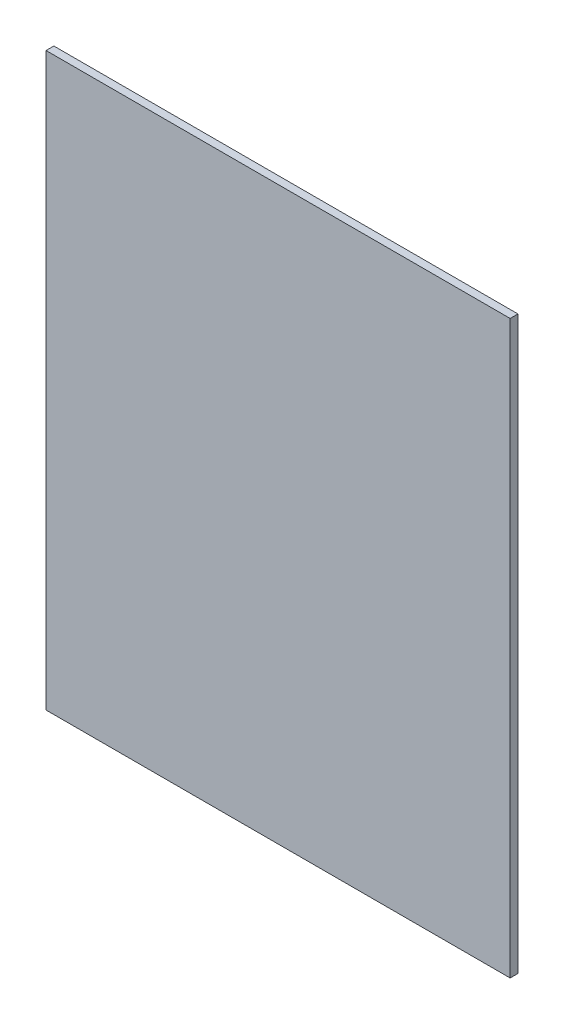
ISO-10303-21;
HEADER;
FILE_DESCRIPTION(('STEP AP214'),'2;1');
FILE_NAME('part.step','',(''),(''),'','','');
FILE_SCHEMA(('AUTOMOTIVE_DESIGN { 1 0 10303 214 1 1 1 1 }'));
ENDSEC;
DATA;
#1=APPLICATION_CONTEXT('core data for automotive mechanical design processes');
#2=APPLICATION_PROTOCOL_DEFINITION('international standard','automotive_design',2000,#1);
#3=PRODUCT_CONTEXT('',#1,'mechanical');
#4=PRODUCT('Part','Part','',(#3));
#5=PRODUCT_RELATED_PRODUCT_CATEGORY('part','',(#4));
#6=PRODUCT_DEFINITION_FORMATION('','',#4);
#7=PRODUCT_DEFINITION_CONTEXT('part definition',#1,'design');
#8=PRODUCT_DEFINITION('design','',#6,#7);
#9=PRODUCT_DEFINITION_SHAPE('','',#8);
#10=(LENGTH_UNIT() NAMED_UNIT(*) SI_UNIT(.MILLI.,.METRE.));
#11=(NAMED_UNIT(*) PLANE_ANGLE_UNIT() SI_UNIT($,.RADIAN.));
#12=(NAMED_UNIT(*) SI_UNIT($,.STERADIAN.) SOLID_ANGLE_UNIT());
#13=UNCERTAINTY_MEASURE_WITH_UNIT(LENGTH_MEASURE(1.E-05),#10,'distance_accuracy_value','');
#14=(GEOMETRIC_REPRESENTATION_CONTEXT(3) GLOBAL_UNCERTAINTY_ASSIGNED_CONTEXT((#13)) GLOBAL_UNIT_ASSIGNED_CONTEXT((#10,
#11,#12)) REPRESENTATION_CONTEXT('',''));
#15=CARTESIAN_POINT('',(0.,0.,0.));
#16=DIRECTION('',(0.,0.,1.));
#17=DIRECTION('',(1.,0.,0.));
#18=AXIS2_PLACEMENT_3D('',#15,#16,#17);
#19=CARTESIAN_POINT('',(0.,0.,11.1125));
#20=DIRECTION('',(1.,0.,0.));
#21=DIRECTION('',(0.,0.,-1.));
#22=AXIS2_PLACEMENT_3D('',#19,#20,#21);
#23=PLANE('',#22);
#24=DIRECTION('',(0.,-1.,0.));
#25=VECTOR('',#24,1.);
#26=CARTESIAN_POINT('',(0.,0.,0.));
#27=LINE('',#26,#25);
#28=CARTESIAN_POINT('',(0.,812.8,0.));
#29=VERTEX_POINT('',#28);
#30=CARTESIAN_POINT('',(0.,0.,0.));
#31=VERTEX_POINT('',#30);
#32=EDGE_CURVE('E97',#29,#31,#27,.T.);
#33=ORIENTED_EDGE('',*,*,#32,.T.);
#34=DIRECTION('',(0.,0.,-1.));
#35=VECTOR('',#34,1.);
#36=CARTESIAN_POINT('',(0.,0.,11.1125));
#37=LINE('',#36,#35);
#38=CARTESIAN_POINT('',(0.,0.,11.1125));
#39=VERTEX_POINT('',#38);
#40=EDGE_CURVE('E11',#39,#31,#37,.T.);
#41=ORIENTED_EDGE('',*,*,#40,.F.);
#42=DIRECTION('',(0.,-1.,0.));
#43=VECTOR('',#42,1.);
#44=CARTESIAN_POINT('',(0.,0.,11.1125));
#45=LINE('',#44,#43);
#46=CARTESIAN_POINT('',(0.,812.8,11.1125));
#47=VERTEX_POINT('',#46);
#48=EDGE_CURVE('E85',#47,#39,#45,.T.);
#49=ORIENTED_EDGE('',*,*,#48,.F.);
#50=DIRECTION('',(0.,0.,-1.));
#51=VECTOR('',#50,1.);
#52=CARTESIAN_POINT('',(0.,812.8,11.1125));
#53=LINE('',#52,#51);
#54=EDGE_CURVE('E93',#47,#29,#53,.T.);
#55=ORIENTED_EDGE('',*,*,#54,.T.);
#56=EDGE_LOOP('',(#33,#41,#49,#55));
#57=FACE_BOUND('',#56,.T.);
#58=ADVANCED_FACE('F34',(#57),#23,.F.);
#59=CARTESIAN_POINT('',(0.,0.,11.1125));
#60=DIRECTION('',(0.,1.,0.));
#61=DIRECTION('',(0.,0.,1.));
#62=AXIS2_PLACEMENT_3D('',#59,#60,#61);
#63=PLANE('',#62);
#64=DIRECTION('',(1.,0.,0.));
#65=VECTOR('',#64,1.);
#66=CARTESIAN_POINT('',(0.,0.,0.));
#67=LINE('',#66,#65);
#68=CARTESIAN_POINT('',(660.4,0.,0.));
#69=VERTEX_POINT('',#68);
#70=EDGE_CURVE('E89',#31,#69,#67,.T.);
#71=ORIENTED_EDGE('',*,*,#70,.T.);
#72=DIRECTION('',(0.,0.,-1.));
#73=VECTOR('',#72,1.);
#74=CARTESIAN_POINT('',(660.4,0.,11.1125));
#75=LINE('',#74,#73);
#76=CARTESIAN_POINT('',(660.4,0.,11.1125));
#77=VERTEX_POINT('',#76);
#78=EDGE_CURVE('E42',#77,#69,#75,.T.);
#79=ORIENTED_EDGE('',*,*,#78,.F.);
#80=DIRECTION('',(1.,0.,0.));
#81=VECTOR('',#80,1.);
#82=CARTESIAN_POINT('',(0.,0.,11.1125));
#83=LINE('',#82,#81);
#84=EDGE_CURVE('E80',#39,#77,#83,.T.);
#85=ORIENTED_EDGE('',*,*,#84,.F.);
#86=ORIENTED_EDGE('',*,*,#40,.T.);
#87=EDGE_LOOP('',(#71,#79,#85,#86));
#88=FACE_BOUND('',#87,.T.);
#89=ADVANCED_FACE('F88',(#88),#63,.F.);
#90=CARTESIAN_POINT('',(660.4,0.,11.1125));
#91=DIRECTION('',(-1.,0.,0.));
#92=DIRECTION('',(0.,-1.,0.));
#93=AXIS2_PLACEMENT_3D('',#90,#91,#92);
#94=PLANE('',#93);
#95=DIRECTION('',(0.,1.,0.));
#96=VECTOR('',#95,1.);
#97=CARTESIAN_POINT('',(660.4,0.,0.));
#98=LINE('',#97,#96);
#99=CARTESIAN_POINT('',(660.4,812.8,0.));
#100=VERTEX_POINT('',#99);
#101=EDGE_CURVE('E67',#69,#100,#98,.T.);
#102=ORIENTED_EDGE('',*,*,#101,.T.);
#103=DIRECTION('',(0.,0.,-1.));
#104=VECTOR('',#103,1.);
#105=CARTESIAN_POINT('',(660.4,812.8,11.1125));
#106=LINE('',#105,#104);
#107=CARTESIAN_POINT('',(660.4,812.8,11.1125));
#108=VERTEX_POINT('',#107);
#109=EDGE_CURVE('E90',#108,#100,#106,.T.);
#110=ORIENTED_EDGE('',*,*,#109,.F.);
#111=DIRECTION('',(0.,1.,0.));
#112=VECTOR('',#111,1.);
#113=CARTESIAN_POINT('',(660.4,0.,11.1125));
#114=LINE('',#113,#112);
#115=EDGE_CURVE('E83',#77,#108,#114,.T.);
#116=ORIENTED_EDGE('',*,*,#115,.F.);
#117=ORIENTED_EDGE('',*,*,#78,.T.);
#118=EDGE_LOOP('',(#102,#110,#116,#117));
#119=FACE_BOUND('',#118,.T.);
#120=ADVANCED_FACE('F91',(#119),#94,.F.);
#121=CARTESIAN_POINT('',(0.,812.8,11.1125));
#122=DIRECTION('',(0.,-1.,0.));
#123=DIRECTION('',(0.,0.,-1.));
#124=AXIS2_PLACEMENT_3D('',#121,#122,#123);
#125=PLANE('',#124);
#126=DIRECTION('',(-1.,0.,0.));
#127=VECTOR('',#126,1.);
#128=CARTESIAN_POINT('',(0.,812.8,0.));
#129=LINE('',#128,#127);
#130=EDGE_CURVE('E73',#100,#29,#129,.T.);
#131=ORIENTED_EDGE('',*,*,#130,.T.);
#132=ORIENTED_EDGE('',*,*,#54,.F.);
#133=DIRECTION('',(-1.,0.,0.));
#134=VECTOR('',#133,1.);
#135=CARTESIAN_POINT('',(0.,812.8,11.1125));
#136=LINE('',#135,#134);
#137=EDGE_CURVE('E50',#108,#47,#136,.T.);
#138=ORIENTED_EDGE('',*,*,#137,.F.);
#139=ORIENTED_EDGE('',*,*,#109,.T.);
#140=EDGE_LOOP('',(#131,#132,#138,#139));
#141=FACE_BOUND('',#140,.T.);
#142=ADVANCED_FACE('F104',(#141),#125,.F.);
#143=CARTESIAN_POINT('',(0.,0.,11.1125));
#144=DIRECTION('',(0.,0.,-1.));
#145=DIRECTION('',(-1.,0.,0.));
#146=AXIS2_PLACEMENT_3D('',#143,#144,#145);
#147=PLANE('',#146);
#148=ORIENTED_EDGE('',*,*,#48,.T.);
#149=ORIENTED_EDGE('',*,*,#84,.T.);
#150=ORIENTED_EDGE('',*,*,#115,.T.);
#151=ORIENTED_EDGE('',*,*,#137,.T.);
#152=EDGE_LOOP('',(#148,#149,#150,#151));
#153=FACE_BOUND('',#152,.T.);
#154=ADVANCED_FACE('F81',(#153),#147,.F.);
#155=CARTESIAN_POINT('',(0.,0.,0.));
#156=DIRECTION('',(0.,0.,-1.));
#157=DIRECTION('',(-1.,0.,0.));
#158=AXIS2_PLACEMENT_3D('',#155,#156,#157);
#159=PLANE('',#158);
#160=ORIENTED_EDGE('',*,*,#32,.F.);
#161=ORIENTED_EDGE('',*,*,#130,.F.);
#162=ORIENTED_EDGE('',*,*,#101,.F.);
#163=ORIENTED_EDGE('',*,*,#70,.F.);
#164=EDGE_LOOP('',(#160,#161,#162,#163));
#165=FACE_BOUND('',#164,.T.);
#166=ADVANCED_FACE('F107',(#165),#159,.T.);
#167=CLOSED_SHELL('',(#58,#89,#120,#142,#154,#166));
#168=MANIFOLD_SOLID_BREP('B2',#167);
#169=ADVANCED_BREP_SHAPE_REPRESENTATION('',(#18,#168),#14);
#170=SHAPE_DEFINITION_REPRESENTATION(#9,#169);
ENDSEC;
END-ISO-10303-21;
